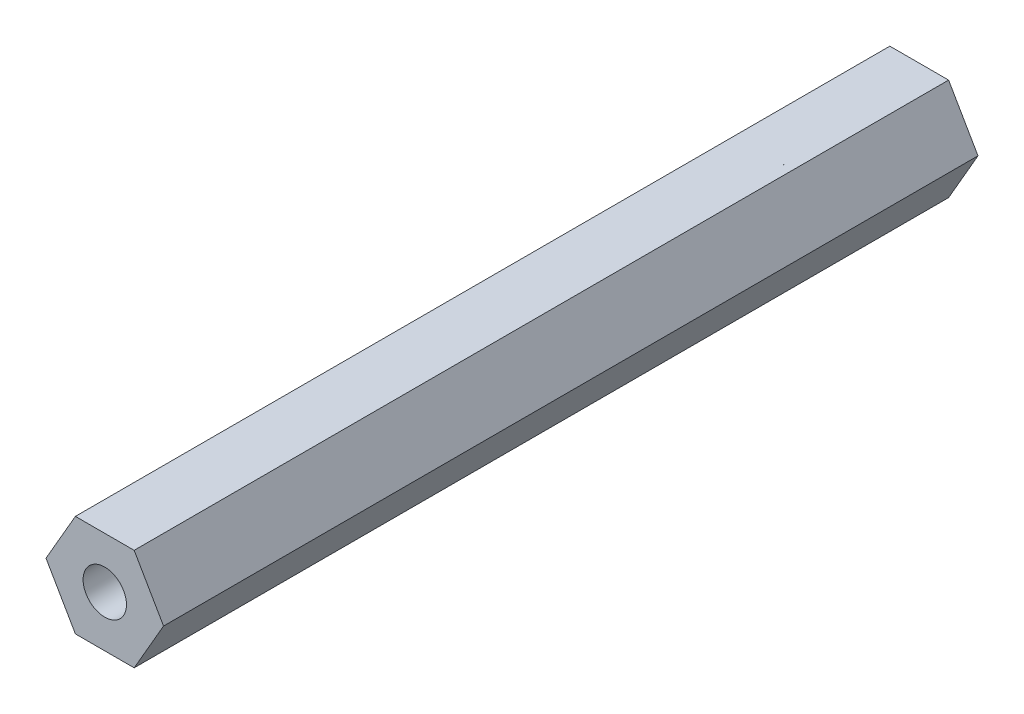
ISO-10303-21;
HEADER;
FILE_DESCRIPTION(('STEP AP214'),'2;1');
FILE_NAME('part.step','',(''),(''),'','','');
FILE_SCHEMA(('AUTOMOTIVE_DESIGN { 1 0 10303 214 1 1 1 1 }'));
ENDSEC;
DATA;
#1=APPLICATION_CONTEXT('core data for automotive mechanical design processes');
#2=APPLICATION_PROTOCOL_DEFINITION('international standard','automotive_design',2000,#1);
#3=PRODUCT_CONTEXT('',#1,'mechanical');
#4=PRODUCT('Part','Part','',(#3));
#5=PRODUCT_RELATED_PRODUCT_CATEGORY('part','',(#4));
#6=PRODUCT_DEFINITION_FORMATION('','',#4);
#7=PRODUCT_DEFINITION_CONTEXT('part definition',#1,'design');
#8=PRODUCT_DEFINITION('design','',#6,#7);
#9=PRODUCT_DEFINITION_SHAPE('','',#8);
#10=(LENGTH_UNIT() NAMED_UNIT(*) SI_UNIT(.MILLI.,.METRE.));
#11=(NAMED_UNIT(*) PLANE_ANGLE_UNIT() SI_UNIT($,.RADIAN.));
#12=(NAMED_UNIT(*) SI_UNIT($,.STERADIAN.) SOLID_ANGLE_UNIT());
#13=UNCERTAINTY_MEASURE_WITH_UNIT(LENGTH_MEASURE(1.E-05),#10,'distance_accuracy_value','');
#14=(GEOMETRIC_REPRESENTATION_CONTEXT(3) GLOBAL_UNCERTAINTY_ASSIGNED_CONTEXT((#13)) GLOBAL_UNIT_ASSIGNED_CONTEXT((#10,
#11,#12)) REPRESENTATION_CONTEXT('',''));
#15=CARTESIAN_POINT('',(0.,0.,0.));
#16=DIRECTION('',(0.,0.,1.));
#17=DIRECTION('',(1.,0.,0.));
#18=AXIS2_PLACEMENT_3D('',#15,#16,#17);
#19=CARTESIAN_POINT('',(3.66617420935412,-6.35000000000001,50.8));
#20=DIRECTION('',(-0.866025403784439,0.5,0.));
#21=DIRECTION('',(-0.5,-0.866025403784439,0.));
#22=AXIS2_PLACEMENT_3D('',#19,#20,#21);
#23=PLANE('',#22);
#24=DIRECTION('',(0.5,0.866025403784439,0.));
#25=VECTOR('',#24,1.);
#26=CARTESIAN_POINT('',(3.66617420935412,-6.35000000000001,-50.8));
#27=LINE('',#26,#25);
#28=CARTESIAN_POINT('',(3.66617420935412,-6.35000000000001,-50.8));
#29=VERTEX_POINT('',#28);
#30=CARTESIAN_POINT('',(7.33234841870824,0.,-50.8));
#31=VERTEX_POINT('',#30);
#32=EDGE_CURVE('E117',#29,#31,#27,.T.);
#33=ORIENTED_EDGE('',*,*,#32,.T.);
#34=DIRECTION('',(0.,0.,-1.));
#35=VECTOR('',#34,1.);
#36=CARTESIAN_POINT('',(7.33234841870824,0.,50.8));
#37=LINE('',#36,#35);
#38=CARTESIAN_POINT('',(7.33234841870824,0.,50.8));
#39=VERTEX_POINT('',#38);
#40=EDGE_CURVE('E11',#39,#31,#37,.T.);
#41=ORIENTED_EDGE('',*,*,#40,.F.);
#42=DIRECTION('',(0.5,0.866025403784439,0.));
#43=VECTOR('',#42,1.);
#44=CARTESIAN_POINT('',(3.66617420935412,-6.35000000000001,50.8));
#45=LINE('',#44,#43);
#46=CARTESIAN_POINT('',(3.66617420935412,-6.35000000000001,50.8));
#47=VERTEX_POINT('',#46);
#48=EDGE_CURVE('E128',#47,#39,#45,.T.);
#49=ORIENTED_EDGE('',*,*,#48,.F.);
#50=DIRECTION('',(0.,0.,-1.));
#51=VECTOR('',#50,1.);
#52=CARTESIAN_POINT('',(3.66617420935412,-6.35000000000001,50.8));
#53=LINE('',#52,#51);
#54=EDGE_CURVE('E113',#47,#29,#53,.T.);
#55=ORIENTED_EDGE('',*,*,#54,.T.);
#56=EDGE_LOOP('',(#33,#41,#49,#55));
#57=FACE_BOUND('',#56,.T.);
#58=ADVANCED_FACE('F33',(#57),#23,.F.);
#59=CARTESIAN_POINT('',(7.33234841870824,0.,50.8));
#60=DIRECTION('',(-0.866025403784439,-0.5,0.));
#61=DIRECTION('',(0.5,-0.866025403784439,0.));
#62=AXIS2_PLACEMENT_3D('',#59,#60,#61);
#63=PLANE('',#62);
#64=DIRECTION('',(-0.5,0.866025403784439,0.));
#65=VECTOR('',#64,1.);
#66=CARTESIAN_POINT('',(7.33234841870824,0.,-50.8));
#67=LINE('',#66,#65);
#68=CARTESIAN_POINT('',(3.66617420935411,6.35000000000001,-50.8));
#69=VERTEX_POINT('',#68);
#70=EDGE_CURVE('E120',#31,#69,#67,.T.);
#71=ORIENTED_EDGE('',*,*,#70,.T.);
#72=DIRECTION('',(0.,0.,-1.));
#73=VECTOR('',#72,1.);
#74=CARTESIAN_POINT('',(3.66617420935411,6.35000000000001,50.8));
#75=LINE('',#74,#73);
#76=CARTESIAN_POINT('',(3.66617420935411,6.35000000000001,50.8));
#77=VERTEX_POINT('',#76);
#78=EDGE_CURVE('E41',#77,#69,#75,.T.);
#79=ORIENTED_EDGE('',*,*,#78,.F.);
#80=DIRECTION('',(-0.5,0.866025403784439,0.));
#81=VECTOR('',#80,1.);
#82=CARTESIAN_POINT('',(7.33234841870824,0.,50.8));
#83=LINE('',#82,#81);
#84=EDGE_CURVE('E86',#39,#77,#83,.T.);
#85=ORIENTED_EDGE('',*,*,#84,.F.);
#86=ORIENTED_EDGE('',*,*,#40,.T.);
#87=EDGE_LOOP('',(#71,#79,#85,#86));
#88=FACE_BOUND('',#87,.T.);
#89=ADVANCED_FACE('F153',(#88),#63,.F.);
#90=CARTESIAN_POINT('',(3.66617420935411,6.35000000000001,50.8));
#91=DIRECTION('',(0.,-1.,0.));
#92=DIRECTION('',(1.,0.,0.));
#93=AXIS2_PLACEMENT_3D('',#90,#91,#92);
#94=PLANE('',#93);
#95=DIRECTION('',(-1.,0.,0.));
#96=VECTOR('',#95,1.);
#97=CARTESIAN_POINT('',(3.66617420935411,6.35000000000001,-50.8));
#98=LINE('',#97,#96);
#99=CARTESIAN_POINT('',(-3.66617420935413,6.35000000000001,-50.8));
#100=VERTEX_POINT('',#99);
#101=EDGE_CURVE('E123',#69,#100,#98,.T.);
#102=ORIENTED_EDGE('',*,*,#101,.T.);
#103=DIRECTION('',(0.,0.,-1.));
#104=VECTOR('',#103,1.);
#105=CARTESIAN_POINT('',(-3.66617420935413,6.35000000000001,50.8));
#106=LINE('',#105,#104);
#107=CARTESIAN_POINT('',(-3.66617420935413,6.35000000000001,50.8));
#108=VERTEX_POINT('',#107);
#109=EDGE_CURVE('E108',#108,#100,#106,.T.);
#110=ORIENTED_EDGE('',*,*,#109,.F.);
#111=DIRECTION('',(-1.,0.,0.));
#112=VECTOR('',#111,1.);
#113=CARTESIAN_POINT('',(3.66617420935411,6.35000000000001,50.8));
#114=LINE('',#113,#112);
#115=EDGE_CURVE('E99',#77,#108,#114,.T.);
#116=ORIENTED_EDGE('',*,*,#115,.F.);
#117=ORIENTED_EDGE('',*,*,#78,.T.);
#118=EDGE_LOOP('',(#102,#110,#116,#117));
#119=FACE_BOUND('',#118,.T.);
#120=ADVANCED_FACE('F134',(#119),#94,.F.);
#121=CARTESIAN_POINT('',(-3.66617420935413,6.35000000000001,50.8));
#122=DIRECTION('',(0.866025403784439,-0.5,0.));
#123=DIRECTION('',(0.5,0.866025403784439,0.));
#124=AXIS2_PLACEMENT_3D('',#121,#122,#123);
#125=PLANE('',#124);
#126=DIRECTION('',(-0.5,-0.866025403784439,0.));
#127=VECTOR('',#126,1.);
#128=CARTESIAN_POINT('',(-3.66617420935413,6.35000000000001,-50.8));
#129=LINE('',#128,#127);
#130=CARTESIAN_POINT('',(-7.33234841870826,0.,-50.8));
#131=VERTEX_POINT('',#130);
#132=EDGE_CURVE('E107',#100,#131,#129,.T.);
#133=ORIENTED_EDGE('',*,*,#132,.T.);
#134=DIRECTION('',(0.,0.,-1.));
#135=VECTOR('',#134,1.);
#136=CARTESIAN_POINT('',(-7.33234841870826,0.,50.8));
#137=LINE('',#136,#135);
#138=CARTESIAN_POINT('',(-7.33234841870826,0.,50.8));
#139=VERTEX_POINT('',#138);
#140=EDGE_CURVE('E104',#139,#131,#137,.T.);
#141=ORIENTED_EDGE('',*,*,#140,.F.);
#142=DIRECTION('',(-0.5,-0.866025403784439,0.));
#143=VECTOR('',#142,1.);
#144=CARTESIAN_POINT('',(-3.66617420935413,6.35000000000001,50.8));
#145=LINE('',#144,#143);
#146=EDGE_CURVE('E93',#108,#139,#145,.T.);
#147=ORIENTED_EDGE('',*,*,#146,.F.);
#148=ORIENTED_EDGE('',*,*,#109,.T.);
#149=EDGE_LOOP('',(#133,#141,#147,#148));
#150=FACE_BOUND('',#149,.T.);
#151=ADVANCED_FACE('F105',(#150),#125,.F.);
#152=CARTESIAN_POINT('',(-7.33234841870826,0.,50.8));
#153=DIRECTION('',(0.866025403784438,0.5,0.));
#154=DIRECTION('',(-0.5,0.866025403784439,0.));
#155=AXIS2_PLACEMENT_3D('',#152,#153,#154);
#156=PLANE('',#155);
#157=DIRECTION('',(0.5,-0.866025403784439,0.));
#158=VECTOR('',#157,1.);
#159=CARTESIAN_POINT('',(-7.33234841870826,0.,-50.8));
#160=LINE('',#159,#158);
#161=CARTESIAN_POINT('',(-3.66617420935413,-6.35000000000001,-50.8));
#162=VERTEX_POINT('',#161);
#163=EDGE_CURVE('E72',#131,#162,#160,.T.);
#164=ORIENTED_EDGE('',*,*,#163,.T.);
#165=DIRECTION('',(0.,0.,-1.));
#166=VECTOR('',#165,1.);
#167=CARTESIAN_POINT('',(-3.66617420935413,-6.35000000000001,50.8));
#168=LINE('',#167,#166);
#169=CARTESIAN_POINT('',(-3.66617420935413,-6.35000000000001,50.8));
#170=VERTEX_POINT('',#169);
#171=EDGE_CURVE('E109',#170,#162,#168,.T.);
#172=ORIENTED_EDGE('',*,*,#171,.F.);
#173=DIRECTION('',(0.5,-0.866025403784439,0.));
#174=VECTOR('',#173,1.);
#175=CARTESIAN_POINT('',(-7.33234841870826,0.,50.8));
#176=LINE('',#175,#174);
#177=EDGE_CURVE('E97',#139,#170,#176,.T.);
#178=ORIENTED_EDGE('',*,*,#177,.F.);
#179=ORIENTED_EDGE('',*,*,#140,.T.);
#180=EDGE_LOOP('',(#164,#172,#178,#179));
#181=FACE_BOUND('',#180,.T.);
#182=ADVANCED_FACE('F111',(#181),#156,.F.);
#183=CARTESIAN_POINT('',(-3.66617420935413,-6.35000000000001,50.8));
#184=DIRECTION('',(0.,1.,0.));
#185=DIRECTION('',(-1.,0.,0.));
#186=AXIS2_PLACEMENT_3D('',#183,#184,#185);
#187=PLANE('',#186);
#188=DIRECTION('',(1.,0.,0.));
#189=VECTOR('',#188,1.);
#190=CARTESIAN_POINT('',(-3.66617420935413,-6.35000000000001,-50.8));
#191=LINE('',#190,#189);
#192=EDGE_CURVE('E78',#162,#29,#191,.T.);
#193=ORIENTED_EDGE('',*,*,#192,.T.);
#194=ORIENTED_EDGE('',*,*,#54,.F.);
#195=DIRECTION('',(1.,0.,0.));
#196=VECTOR('',#195,1.);
#197=CARTESIAN_POINT('',(-3.66617420935413,-6.35000000000001,50.8));
#198=LINE('',#197,#196);
#199=EDGE_CURVE('E49',#170,#47,#198,.T.);
#200=ORIENTED_EDGE('',*,*,#199,.F.);
#201=ORIENTED_EDGE('',*,*,#171,.T.);
#202=EDGE_LOOP('',(#193,#194,#200,#201));
#203=FACE_BOUND('',#202,.T.);
#204=ADVANCED_FACE('F141',(#203),#187,.F.);
#205=CARTESIAN_POINT('',(0.,0.,50.8));
#206=DIRECTION('',(0.,0.,1.));
#207=DIRECTION('',(1.,0.,0.));
#208=AXIS2_PLACEMENT_3D('',#205,#206,#207);
#209=PLANE('',#208);
#210=CARTESIAN_POINT('',(0.,0.,50.8));
#211=DIRECTION('',(0.,0.,1.));
#212=DIRECTION('',(1.,0.,0.));
#213=AXIS2_PLACEMENT_3D('',#210,#211,#212);
#214=CIRCLE('',#213,2.7051);
#215=CARTESIAN_POINT('',(2.7051,0.,50.8));
#216=VERTEX_POINT('',#215);
#217=EDGE_CURVE('E121',#216,#216,#214,.T.);
#218=ORIENTED_EDGE('',*,*,#217,.F.);
#219=EDGE_LOOP('',(#218));
#220=FACE_BOUND('',#219,.T.);
#221=ORIENTED_EDGE('',*,*,#48,.T.);
#222=ORIENTED_EDGE('',*,*,#84,.T.);
#223=ORIENTED_EDGE('',*,*,#115,.T.);
#224=ORIENTED_EDGE('',*,*,#146,.T.);
#225=ORIENTED_EDGE('',*,*,#177,.T.);
#226=ORIENTED_EDGE('',*,*,#199,.T.);
#227=EDGE_LOOP('',(#221,#222,#223,#224,#225,#226));
#228=FACE_BOUND('',#227,.T.);
#229=ADVANCED_FACE('F95',(#220,#228),#209,.T.);
#230=CARTESIAN_POINT('',(0.,0.,-50.8));
#231=DIRECTION('',(0.,0.,1.));
#232=DIRECTION('',(1.,0.,0.));
#233=AXIS2_PLACEMENT_3D('',#230,#231,#232);
#234=PLANE('',#233);
#235=CARTESIAN_POINT('',(0.,0.,-50.8));
#236=DIRECTION('',(0.,0.,-1.));
#237=DIRECTION('',(-1.,0.,0.));
#238=AXIS2_PLACEMENT_3D('',#235,#236,#237);
#239=CIRCLE('',#238,2.70509999999999);
#240=CARTESIAN_POINT('',(-2.70509999999999,0.,-50.8));
#241=VERTEX_POINT('',#240);
#242=EDGE_CURVE('E211',#241,#241,#239,.T.);
#243=ORIENTED_EDGE('',*,*,#242,.F.);
#244=EDGE_LOOP('',(#243));
#245=FACE_BOUND('',#244,.T.);
#246=ORIENTED_EDGE('',*,*,#32,.F.);
#247=ORIENTED_EDGE('',*,*,#192,.F.);
#248=ORIENTED_EDGE('',*,*,#163,.F.);
#249=ORIENTED_EDGE('',*,*,#132,.F.);
#250=ORIENTED_EDGE('',*,*,#101,.F.);
#251=ORIENTED_EDGE('',*,*,#70,.F.);
#252=EDGE_LOOP('',(#246,#247,#248,#249,#250,#251));
#253=FACE_BOUND('',#252,.T.);
#254=ADVANCED_FACE('F137',(#245,#253),#234,.F.);
#255=CARTESIAN_POINT('',(0.,0.,50.8));
#256=DIRECTION('',(0.,0.,1.));
#257=DIRECTION('',(1.,0.,0.));
#258=AXIS2_PLACEMENT_3D('',#255,#256,#257);
#259=CYLINDRICAL_SURFACE('',#258,2.70509999999999);
#260=ORIENTED_EDGE('',*,*,#217,.T.);
#261=EDGE_LOOP('',(#260));
#262=FACE_BOUND('',#261,.T.);
#263=ORIENTED_EDGE('',*,*,#242,.T.);
#264=EDGE_LOOP('',(#263));
#265=FACE_BOUND('',#264,.T.);
#266=ADVANCED_FACE('F190',(#262,#265),#259,.F.);
#267=CLOSED_SHELL('',(#58,#89,#120,#151,#182,#204,#229,#254,#266));
#268=MANIFOLD_SOLID_BREP('B2',#267);
#269=ADVANCED_BREP_SHAPE_REPRESENTATION('',(#18,#268),#14);
#270=SHAPE_DEFINITION_REPRESENTATION(#9,#269);
ENDSEC;
END-ISO-10303-21;
